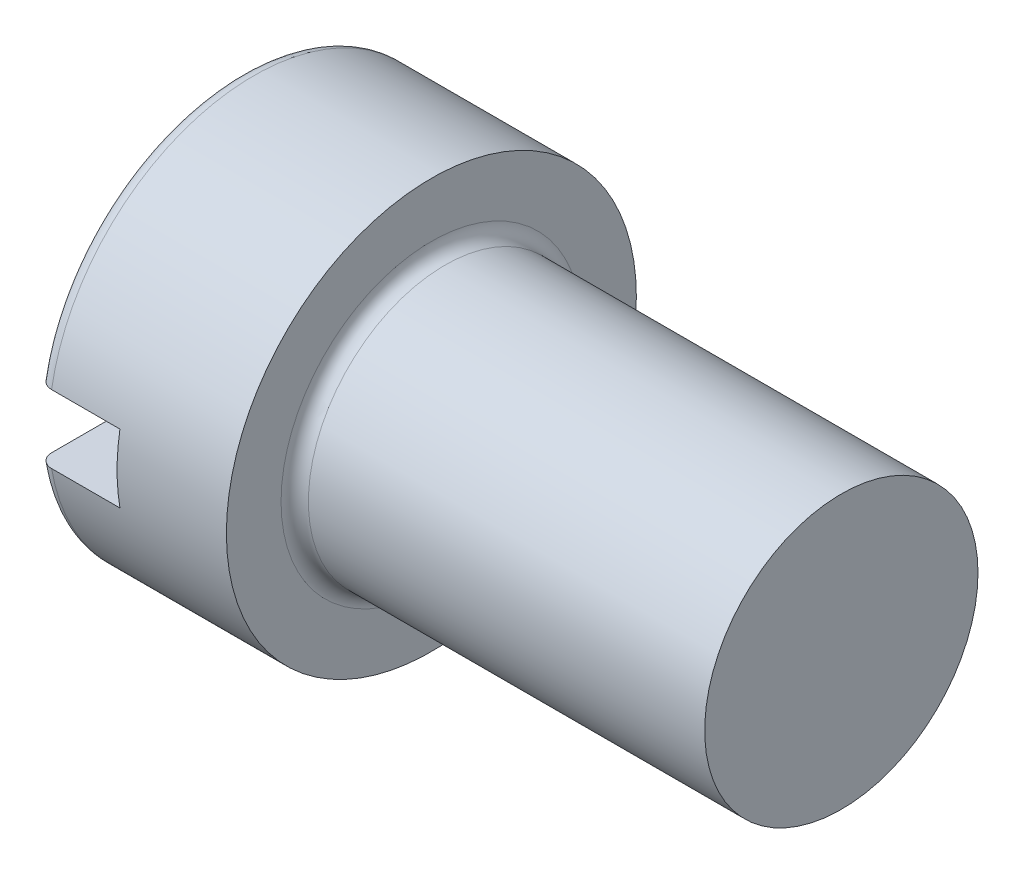
ISO-10303-21;
HEADER;
FILE_DESCRIPTION(('STEP AP214'),'2;1');
FILE_NAME('part.step','',(''),(''),'','','');
FILE_SCHEMA(('AUTOMOTIVE_DESIGN { 1 0 10303 214 1 1 1 1 }'));
ENDSEC;
DATA;
#1=APPLICATION_CONTEXT('core data for automotive mechanical design processes');
#2=APPLICATION_PROTOCOL_DEFINITION('international standard','automotive_design',2000,#1);
#3=PRODUCT_CONTEXT('',#1,'mechanical');
#4=PRODUCT('Part','Part','',(#3));
#5=PRODUCT_RELATED_PRODUCT_CATEGORY('part','',(#4));
#6=PRODUCT_DEFINITION_FORMATION('','',#4);
#7=PRODUCT_DEFINITION_CONTEXT('part definition',#1,'design');
#8=PRODUCT_DEFINITION('design','',#6,#7);
#9=PRODUCT_DEFINITION_SHAPE('','',#8);
#10=(LENGTH_UNIT() NAMED_UNIT(*) SI_UNIT(.MILLI.,.METRE.));
#11=(NAMED_UNIT(*) PLANE_ANGLE_UNIT() SI_UNIT($,.RADIAN.));
#12=(NAMED_UNIT(*) SI_UNIT($,.STERADIAN.) SOLID_ANGLE_UNIT());
#13=UNCERTAINTY_MEASURE_WITH_UNIT(LENGTH_MEASURE(1.E-05),#10,'distance_accuracy_value','');
#14=(GEOMETRIC_REPRESENTATION_CONTEXT(3) GLOBAL_UNCERTAINTY_ASSIGNED_CONTEXT((#13)) GLOBAL_UNIT_ASSIGNED_CONTEXT((#10,
#11,#12)) REPRESENTATION_CONTEXT('',''));
#15=CARTESIAN_POINT('',(0.,0.,0.));
#16=DIRECTION('',(0.,0.,1.));
#17=DIRECTION('',(1.,0.,0.));
#18=AXIS2_PLACEMENT_3D('',#15,#16,#17);
#19=CARTESIAN_POINT('',(1.4,0.,0.));
#20=DIRECTION('',(1.,0.,0.));
#21=DIRECTION('',(0.,0.,-1.));
#22=AXIS2_PLACEMENT_3D('',#19,#20,#21);
#23=PLANE('',#22);
#24=CARTESIAN_POINT('',(1.4,0.,0.));
#25=DIRECTION('',(1.,0.,0.));
#26=DIRECTION('',(0.,0.,-1.));
#27=AXIS2_PLACEMENT_3D('',#24,#25,#26);
#28=CIRCLE('',#27,1.1);
#29=CARTESIAN_POINT('',(1.4,0.,-1.1));
#30=VERTEX_POINT('',#29);
#31=EDGE_CURVE('E115',#30,#30,#28,.F.);
#32=ORIENTED_EDGE('',*,*,#31,.T.);
#33=EDGE_LOOP('',(#32));
#34=FACE_BOUND('',#33,.T.);
#35=CARTESIAN_POINT('',(1.4,0.,0.));
#36=DIRECTION('',(1.,0.,0.));
#37=DIRECTION('',(0.,0.,-1.));
#38=AXIS2_PLACEMENT_3D('',#35,#36,#37);
#39=CIRCLE('',#38,1.5);
#40=CARTESIAN_POINT('',(1.4,0.,-1.5));
#41=VERTEX_POINT('',#40);
#42=EDGE_CURVE('E129',#41,#41,#39,.T.);
#43=ORIENTED_EDGE('',*,*,#42,.T.);
#44=EDGE_LOOP('',(#43));
#45=FACE_BOUND('',#44,.T.);
#46=ADVANCED_FACE('F44',(#34,#45),#23,.T.);
#47=CARTESIAN_POINT('',(4.39999999990914,0.,0.));
#48=DIRECTION('',(-1.,0.,0.));
#49=DIRECTION('',(0.,0.,1.));
#50=AXIS2_PLACEMENT_3D('',#47,#48,#49);
#51=CYLINDRICAL_SURFACE('',#50,1.);
#52=CARTESIAN_POINT('',(1.5,0.,0.));
#53=DIRECTION('',(1.,0.,0.));
#54=DIRECTION('',(0.,0.,-1.));
#55=AXIS2_PLACEMENT_3D('',#52,#53,#54);
#56=CIRCLE('',#55,1.);
#57=CARTESIAN_POINT('',(1.5,0.,-1.));
#58=VERTEX_POINT('',#57);
#59=EDGE_CURVE('E138',#58,#58,#56,.T.);
#60=ORIENTED_EDGE('',*,*,#59,.T.);
#61=EDGE_LOOP('',(#60));
#62=FACE_BOUND('',#61,.T.);
#63=CARTESIAN_POINT('',(4.39999999990914,0.,0.));
#64=DIRECTION('',(1.,0.,0.));
#65=DIRECTION('',(0.,0.,-1.));
#66=AXIS2_PLACEMENT_3D('',#63,#64,#65);
#67=CIRCLE('',#66,1.);
#68=CARTESIAN_POINT('',(4.39999999990914,0.,-1.));
#69=VERTEX_POINT('',#68);
#70=EDGE_CURVE('E123',#69,#69,#67,.T.);
#71=ORIENTED_EDGE('',*,*,#70,.F.);
#72=EDGE_LOOP('',(#71));
#73=FACE_BOUND('',#72,.T.);
#74=ADVANCED_FACE('F174',(#62,#73),#51,.T.);
#75=CARTESIAN_POINT('',(4.39999999990914,0.,0.));
#76=DIRECTION('',(1.,0.,0.));
#77=DIRECTION('',(0.,0.,-1.));
#78=AXIS2_PLACEMENT_3D('',#75,#76,#77);
#79=PLANE('',#78);
#80=ORIENTED_EDGE('',*,*,#70,.T.);
#81=EDGE_LOOP('',(#80));
#82=FACE_BOUND('',#81,.T.);
#83=ADVANCED_FACE('F169',(#82),#79,.T.);
#84=CARTESIAN_POINT('',(1.5,0.,0.));
#85=DIRECTION('',(1.,0.,0.));
#86=DIRECTION('',(0.,0.,-1.));
#87=AXIS2_PLACEMENT_3D('',#84,#85,#86);
#88=TOROIDAL_SURFACE('',#87,1.1,0.1);
#89=ORIENTED_EDGE('',*,*,#31,.F.);
#90=EDGE_LOOP('',(#89));
#91=FACE_BOUND('',#90,.T.);
#92=ORIENTED_EDGE('',*,*,#59,.F.);
#93=EDGE_LOOP('',(#92));
#94=FACE_BOUND('',#93,.T.);
#95=ADVANCED_FACE('F173',(#91,#94),#88,.F.);
#96=CARTESIAN_POINT('',(4.39999999990914,0.,0.));
#97=DIRECTION('',(-1.,0.,0.));
#98=DIRECTION('',(0.,0.,1.));
#99=AXIS2_PLACEMENT_3D('',#96,#97,#98);
#100=CYLINDRICAL_SURFACE('',#99,1.5);
#101=ORIENTED_EDGE('',*,*,#42,.F.);
#102=EDGE_LOOP('',(#101));
#103=FACE_BOUND('',#102,.T.);
#104=DIRECTION('',(-1.,0.,0.));
#105=VECTOR('',#104,1.);
#106=CARTESIAN_POINT('',(4.39999999990914,-0.25,1.4790199457749));
#107=LINE('',#106,#105);
#108=CARTESIAN_POINT('',(0.6,-0.25,1.4790199457749));
#109=VERTEX_POINT('',#108);
#110=CARTESIAN_POINT('',(0.1,-0.25,1.4790199457749));
#111=VERTEX_POINT('',#110);
#112=EDGE_CURVE('E202',#109,#111,#107,.T.);
#113=ORIENTED_EDGE('',*,*,#112,.T.);
#114=CARTESIAN_POINT('',(0.1,0.,0.));
#115=DIRECTION('',(1.,0.,0.));
#116=DIRECTION('',(0.,0.,-1.));
#117=AXIS2_PLACEMENT_3D('',#114,#115,#116);
#118=CIRCLE('',#117,1.5);
#119=CARTESIAN_POINT('',(0.1,-0.25,-1.4790199457749));
#120=VERTEX_POINT('',#119);
#121=EDGE_CURVE('E210',#111,#120,#118,.T.);
#122=ORIENTED_EDGE('',*,*,#121,.T.);
#123=DIRECTION('',(-1.,0.,0.));
#124=VECTOR('',#123,1.);
#125=CARTESIAN_POINT('',(4.39999999990914,-0.25,-1.4790199457749));
#126=LINE('',#125,#124);
#127=CARTESIAN_POINT('',(0.6,-0.25,-1.4790199457749));
#128=VERTEX_POINT('',#127);
#129=EDGE_CURVE('E109',#120,#128,#126,.F.);
#130=ORIENTED_EDGE('',*,*,#129,.T.);
#131=CARTESIAN_POINT('',(0.6,0.,0.));
#132=DIRECTION('',(1.,0.,0.));
#133=DIRECTION('',(0.,0.,-1.));
#134=AXIS2_PLACEMENT_3D('',#131,#132,#133);
#135=CIRCLE('',#134,1.5);
#136=CARTESIAN_POINT('',(0.6,0.250000000000001,-1.4790199457749));
#137=VERTEX_POINT('',#136);
#138=EDGE_CURVE('E103',#128,#137,#135,.T.);
#139=ORIENTED_EDGE('',*,*,#138,.T.);
#140=DIRECTION('',(-1.,0.,0.));
#141=VECTOR('',#140,1.);
#142=CARTESIAN_POINT('',(4.39999999990914,0.250000000000003,-1.4790199457749));
#143=LINE('',#142,#141);
#144=CARTESIAN_POINT('',(0.1,0.250000000000003,-1.4790199457749));
#145=VERTEX_POINT('',#144);
#146=EDGE_CURVE('E107',#137,#145,#143,.T.);
#147=ORIENTED_EDGE('',*,*,#146,.T.);
#148=CARTESIAN_POINT('',(0.1,0.,0.));
#149=DIRECTION('',(1.,0.,0.));
#150=DIRECTION('',(0.,0.,-1.));
#151=AXIS2_PLACEMENT_3D('',#148,#149,#150);
#152=CIRCLE('',#151,1.5);
#153=CARTESIAN_POINT('',(0.1,0.250000000000003,1.4790199457749));
#154=VERTEX_POINT('',#153);
#155=EDGE_CURVE('E208',#145,#154,#152,.T.);
#156=ORIENTED_EDGE('',*,*,#155,.T.);
#157=DIRECTION('',(-1.,0.,0.));
#158=VECTOR('',#157,1.);
#159=CARTESIAN_POINT('',(4.39999999990914,0.250000000000003,1.4790199457749));
#160=LINE('',#159,#158);
#161=CARTESIAN_POINT('',(0.6,0.250000000000001,1.4790199457749));
#162=VERTEX_POINT('',#161);
#163=EDGE_CURVE('E203',#154,#162,#160,.F.);
#164=ORIENTED_EDGE('',*,*,#163,.T.);
#165=EDGE_CURVE('E114',#162,#109,#135,.T.);
#166=ORIENTED_EDGE('',*,*,#165,.T.);
#167=EDGE_LOOP('',(#113,#122,#130,#139,#147,#156,#164,#166));
#168=FACE_BOUND('',#167,.T.);
#169=ADVANCED_FACE('F106',(#103,#168),#100,.T.);
#170=CARTESIAN_POINT('',(0.6,-0.25,-1.9));
#171=DIRECTION('',(1.,0.,0.));
#172=DIRECTION('',(0.,0.,-1.));
#173=AXIS2_PLACEMENT_3D('',#170,#171,#172);
#174=PLANE('',#173);
#175=ORIENTED_EDGE('',*,*,#165,.F.);
#176=DIRECTION('',(0.,0.,1.));
#177=VECTOR('',#176,1.);
#178=CARTESIAN_POINT('',(0.6,0.250000000000001,-1.9));
#179=LINE('',#178,#177);
#180=EDGE_CURVE('E119',#137,#162,#179,.T.);
#181=ORIENTED_EDGE('',*,*,#180,.F.);
#182=ORIENTED_EDGE('',*,*,#138,.F.);
#183=DIRECTION('',(0.,0.,1.));
#184=VECTOR('',#183,1.);
#185=CARTESIAN_POINT('',(0.6,-0.25,-1.9));
#186=LINE('',#185,#184);
#187=EDGE_CURVE('E124',#128,#109,#186,.T.);
#188=ORIENTED_EDGE('',*,*,#187,.T.);
#189=EDGE_LOOP('',(#175,#181,#182,#188));
#190=FACE_BOUND('',#189,.T.);
#191=ADVANCED_FACE('F122',(#190),#174,.F.);
#192=CARTESIAN_POINT('',(0.,0.25,-1.9));
#193=DIRECTION('',(0.,1.,0.));
#194=DIRECTION('',(-1.,0.,0.));
#195=AXIS2_PLACEMENT_3D('',#192,#193,#194);
#196=PLANE('',#195);
#197=DIRECTION('',(0.,0.,1.));
#198=VECTOR('',#197,1.);
#199=CARTESIAN_POINT('',(0.,0.25,0.));
#200=LINE('',#199,#198);
#201=CARTESIAN_POINT('',(0.,0.25,-1.37749773139559));
#202=VERTEX_POINT('',#201);
#203=CARTESIAN_POINT('',(0.,0.25,1.37749773139559));
#204=VERTEX_POINT('',#203);
#205=EDGE_CURVE('E127',#202,#204,#200,.T.);
#206=ORIENTED_EDGE('',*,*,#205,.F.);
#207=CARTESIAN_POINT('',(0.,0.25,-1.37749773139559));
#208=CARTESIAN_POINT('',(-4.51962237202721E-06,0.25,-1.38327561466897));
#209=CARTESIAN_POINT('',(0.000484540476616252,0.25,-1.38905277896921));
#210=CARTESIAN_POINT('',(0.00241850427267125,0.25,-1.40044328379042));
#211=CARTESIAN_POINT('',(0.00386314125782537,0.25,-1.40605666956744));
#212=CARTESIAN_POINT('',(0.00767828061503996,0.25,-1.4169643672149));
#213=CARTESIAN_POINT('',(0.0100494161411575,0.25,-1.42225845802224));
#214=CARTESIAN_POINT('',(0.0156531114589499,0.25,-1.43236735100074));
#215=CARTESIAN_POINT('',(0.0188853880541812,0.25,-1.43718231002635));
#216=CARTESIAN_POINT('',(0.0260941965064199,0.25,-1.44615344469274));
#217=CARTESIAN_POINT('',(0.0300643834070367,0.25,-1.450314716574));
#218=CARTESIAN_POINT('',(0.0386572626677165,0.25,-1.45790065073083));
#219=CARTESIAN_POINT('',(0.0432800648289143,0.25,-1.4613251888073));
#220=CARTESIAN_POINT('',(0.0529745208878046,0.25,-1.46728705568329));
#221=CARTESIAN_POINT('',(0.0580388243448463,0.25,-1.46983635300901));
#222=CARTESIAN_POINT('',(0.0685258595346013,0.25,-1.47403468054353));
#223=CARTESIAN_POINT('',(0.0739483031894057,0.25,-1.47568442467411));
#224=CARTESIAN_POINT('',(0.0828426951818923,0.25,-1.47757739901138));
#225=CARTESIAN_POINT('',(0.0862541329277417,0.25,-1.47811805236472));
#226=CARTESIAN_POINT('',(0.0931098562547379,0.25,-1.47883923059587));
#227=CARTESIAN_POINT('',(0.096554087117261,0.25,-1.47902027582444));
#228=CARTESIAN_POINT('',(0.0999999999999469,0.25,-1.47901994577515));
#229=B_SPLINE_CURVE_WITH_KNOTS('',3,(#207,#208,#209,#210,#211,#212,#213,#214,#215,#216,#217,
#218,#219,#220,#221,#222,#223,#224,#225,#226,#227,#228),.UNSPECIFIED.,.F.,.F.,(4,2,2,2,2,2,2,2,
2,2,4),(0.,0.017312064362878,0.0346192987778577,0.051938381419823,0.069251775491751,
0.086422662872541,0.103596442669422,0.120525035190562,0.137440172868256,0.147784853194134,
0.158114553894397),.UNSPECIFIED.);
#230=EDGE_CURVE('E12',#202,#145,#229,.T.);
#231=ORIENTED_EDGE('',*,*,#230,.T.);
#232=ORIENTED_EDGE('',*,*,#146,.F.);
#233=ORIENTED_EDGE('',*,*,#180,.T.);
#234=ORIENTED_EDGE('',*,*,#163,.F.);
#235=CARTESIAN_POINT('',(0.1,0.250000000000003,1.4790199457749));
#236=CARTESIAN_POINT('',(0.094432263239052,0.250000000000001,1.47902503055942));
#237=CARTESIAN_POINT('',(0.0888663911199395,0.250000000000001,1.47854867251479));
#238=CARTESIAN_POINT('',(0.0778992826475407,0.25,1.47667110901429));
#239=CARTESIAN_POINT('',(0.0724978619494019,0.25,1.4752709822525));
#240=CARTESIAN_POINT('',(0.0620050189140858,0.25,1.47158310986433));
#241=CARTESIAN_POINT('',(0.0569137062368851,0.25,1.46929505233324));
#242=CARTESIAN_POINT('',(0.0471848350270685,0.25,1.46390206881162));
#243=CARTESIAN_POINT('',(0.042547244473237,0.25,1.46079720052424));
#244=CARTESIAN_POINT('',(0.0338258269859854,0.25,1.45384125221807));
#245=CARTESIAN_POINT('',(0.0297454009998116,0.25,1.44998590994135));
#246=CARTESIAN_POINT('',(0.022278693523147,0.25,1.44165224976008));
#247=CARTESIAN_POINT('',(0.0188925590055686,0.25,1.43717380028756));
#248=CARTESIAN_POINT('',(0.0128623061357907,0.25,1.42765778199153));
#249=CARTESIAN_POINT('',(0.0102288271072733,0.25,1.42261347863481));
#250=CARTESIAN_POINT('',(0.00583367268567679,0.25,1.41215921927282));
#251=CARTESIAN_POINT('',(0.00407168755371425,0.25,1.40674939395634));
#252=CARTESIAN_POINT('',(0.00184727838903206,0.25,1.39734615924574));
#253=CARTESIAN_POINT('',(0.00115484995774497,0.25,1.39340549687007));
#254=CARTESIAN_POINT('',(0.000231234727635603,0.25,1.3854762561934));
#255=CARTESIAN_POINT('',(-6.16909699871885E-07,0.25,1.38148775533202));
#256=CARTESIAN_POINT('',(-9.41134700359602E-13,0.25,1.37749773139581));
#257=B_SPLINE_CURVE_WITH_KNOTS('',3,(#235,#236,#237,#238,#239,#240,#241,#242,#243,#244,#245,
#246,#247,#248,#249,#250,#251,#252,#253,#254,#255,#256),.UNSPECIFIED.,.F.,.F.,(4,2,2,2,2,2,2,2,
2,2,4),(0.,0.0166801138099756,0.0333407844733786,0.0500073128595125,0.066672664163841,
0.0834355823268095,0.100202045336881,0.117194955827457,0.134181822496,0.146159480941721,
0.15811983714386),.UNSPECIFIED.);
#258=EDGE_CURVE('E58',#154,#204,#257,.T.);
#259=ORIENTED_EDGE('',*,*,#258,.T.);
#260=EDGE_LOOP('',(#206,#231,#232,#233,#234,#259));
#261=FACE_BOUND('',#260,.T.);
#262=ADVANCED_FACE('F118',(#261),#196,.F.);
#263=CARTESIAN_POINT('',(0.,-0.25,-1.9));
#264=DIRECTION('',(0.,-1.,0.));
#265=DIRECTION('',(0.,0.,-1.));
#266=AXIS2_PLACEMENT_3D('',#263,#264,#265);
#267=PLANE('',#266);
#268=DIRECTION('',(0.,0.,-1.));
#269=VECTOR('',#268,1.);
#270=CARTESIAN_POINT('',(0.,-0.25,0.));
#271=LINE('',#270,#269);
#272=CARTESIAN_POINT('',(0.,-0.25,1.37749773139559));
#273=VERTEX_POINT('',#272);
#274=CARTESIAN_POINT('',(0.,-0.25,-1.37749773139559));
#275=VERTEX_POINT('',#274);
#276=EDGE_CURVE('E135',#273,#275,#271,.T.);
#277=ORIENTED_EDGE('',*,*,#276,.F.);
#278=CARTESIAN_POINT('',(0.,-0.25,1.37749773139559));
#279=CARTESIAN_POINT('',(-4.51962237210414E-06,-0.25,1.38327561466897));
#280=CARTESIAN_POINT('',(0.000484540476616196,-0.25,1.38905277896921));
#281=CARTESIAN_POINT('',(0.00241850427267128,-0.25,1.40044328379042));
#282=CARTESIAN_POINT('',(0.00386314125782546,-0.25,1.40605666956744));
#283=CARTESIAN_POINT('',(0.00767828061504005,-0.25,1.4169643672149));
#284=CARTESIAN_POINT('',(0.0100494161411575,-0.25,1.42225845802224));
#285=CARTESIAN_POINT('',(0.01565311145895,-0.25,1.43236735100074));
#286=CARTESIAN_POINT('',(0.0188853880541813,-0.25,1.43718231002635));
#287=CARTESIAN_POINT('',(0.0260941965064201,-0.25,1.44615344469274));
#288=CARTESIAN_POINT('',(0.0300643834070369,-0.25,1.450314716574));
#289=CARTESIAN_POINT('',(0.0386572626677168,-0.25,1.45790065073083));
#290=CARTESIAN_POINT('',(0.0432800648289147,-0.25,1.4613251888073));
#291=CARTESIAN_POINT('',(0.052974520887805,-0.25,1.46728705568329));
#292=CARTESIAN_POINT('',(0.0580388243448468,-0.25,1.46983635300901));
#293=CARTESIAN_POINT('',(0.0685258595346017,-0.25,1.47403468054353));
#294=CARTESIAN_POINT('',(0.0739483031894062,-0.25,1.47568442467411));
#295=CARTESIAN_POINT('',(0.0828426951818927,-0.25,1.47757739901138));
#296=CARTESIAN_POINT('',(0.0862541329277421,-0.25,1.47811805236472));
#297=CARTESIAN_POINT('',(0.0931098562547381,-0.25,1.47883923059587));
#298=CARTESIAN_POINT('',(0.0965540871172611,-0.25,1.47902027582444));
#299=CARTESIAN_POINT('',(0.0999999999999469,-0.25,1.47901994577515));
#300=B_SPLINE_CURVE_WITH_KNOTS('',3,(#278,#279,#280,#281,#282,#283,#284,#285,#286,#287,#288,
#289,#290,#291,#292,#293,#294,#295,#296,#297,#298,#299),.UNSPECIFIED.,.F.,.F.,(4,2,2,2,2,2,2,2,
2,2,4),(0.,0.0173120643628782,0.0346192987778579,0.0519383814198232,0.0692517754917513,
0.0864226628725416,0.103596442669423,0.120525035190563,0.137440172868256,0.147784853194134,
0.158114553894397),.UNSPECIFIED.);
#301=EDGE_CURVE('E153',#273,#111,#300,.T.);
#302=ORIENTED_EDGE('',*,*,#301,.T.);
#303=ORIENTED_EDGE('',*,*,#112,.F.);
#304=ORIENTED_EDGE('',*,*,#187,.F.);
#305=ORIENTED_EDGE('',*,*,#129,.F.);
#306=CARTESIAN_POINT('',(0.1,-0.25,-1.4790199457749));
#307=CARTESIAN_POINT('',(0.0944322632390521,-0.25,-1.47902503055942));
#308=CARTESIAN_POINT('',(0.0888663911199396,-0.25,-1.47854867251479));
#309=CARTESIAN_POINT('',(0.0778992826475408,-0.25,-1.47667110901429));
#310=CARTESIAN_POINT('',(0.072497861949402,-0.25,-1.4752709822525));
#311=CARTESIAN_POINT('',(0.0620050189140858,-0.25,-1.47158310986433));
#312=CARTESIAN_POINT('',(0.0569137062368851,-0.25,-1.46929505233324));
#313=CARTESIAN_POINT('',(0.0471848350270685,-0.25,-1.46390206881162));
#314=CARTESIAN_POINT('',(0.0425472444732371,-0.25,-1.46079720052424));
#315=CARTESIAN_POINT('',(0.0338258269859856,-0.25,-1.45384125221807));
#316=CARTESIAN_POINT('',(0.0297454009998118,-0.25,-1.44998590994135));
#317=CARTESIAN_POINT('',(0.0222786935231473,-0.25,-1.44165224976008));
#318=CARTESIAN_POINT('',(0.0188925590055688,-0.25,-1.43717380028756));
#319=CARTESIAN_POINT('',(0.0128623061357908,-0.25,-1.42765778199154));
#320=CARTESIAN_POINT('',(0.0102288271072733,-0.25,-1.42261347863481));
#321=CARTESIAN_POINT('',(0.00583367268567676,-0.25,-1.41215921927282));
#322=CARTESIAN_POINT('',(0.00407168755371425,-0.25,-1.40674939395634));
#323=CARTESIAN_POINT('',(0.00184727838903207,-0.25,-1.39734615924574));
#324=CARTESIAN_POINT('',(0.00115484995774496,-0.25,-1.39340549687007));
#325=CARTESIAN_POINT('',(0.000231234727635586,-0.25,-1.3854762561934));
#326=CARTESIAN_POINT('',(-6.16909699891273E-07,-0.25,-1.38148775533202));
#327=CARTESIAN_POINT('',(-9.41127924096024E-13,-0.25,-1.37749773139581));
#328=B_SPLINE_CURVE_WITH_KNOTS('',3,(#306,#307,#308,#309,#310,#311,#312,#313,#314,#315,#316,
#317,#318,#319,#320,#321,#322,#323,#324,#325,#326,#327),.UNSPECIFIED.,.F.,.F.,(4,2,2,2,2,2,2,2,
2,2,4),(0.,0.0166801138099755,0.0333407844733785,0.0500073128595125,0.0666726641638407,
0.0834355823268091,0.100202045336881,0.117194955827457,0.134181822496,0.146159480941721,
0.15811983714386),.UNSPECIFIED.);
#329=EDGE_CURVE('E146',#120,#275,#328,.T.);
#330=ORIENTED_EDGE('',*,*,#329,.T.);
#331=EDGE_LOOP('',(#277,#302,#303,#304,#305,#330));
#332=FACE_BOUND('',#331,.T.);
#333=ADVANCED_FACE('F162',(#332),#267,.F.);
#334=CARTESIAN_POINT('',(0.,0.,0.));
#335=DIRECTION('',(1.,0.,0.));
#336=DIRECTION('',(0.,0.,-1.));
#337=AXIS2_PLACEMENT_3D('',#334,#335,#336);
#338=PLANE('',#337);
#339=ORIENTED_EDGE('',*,*,#205,.T.);
#340=CARTESIAN_POINT('',(0.,0.,0.));
#341=DIRECTION('',(1.,0.,0.));
#342=DIRECTION('',(0.,0.,-1.));
#343=AXIS2_PLACEMENT_3D('',#340,#341,#342);
#344=CIRCLE('',#343,1.4);
#345=EDGE_CURVE('E209',#204,#202,#344,.F.);
#346=ORIENTED_EDGE('',*,*,#345,.T.);
#347=EDGE_LOOP('',(#339,#346));
#348=FACE_BOUND('',#347,.T.);
#349=ADVANCED_FACE('F167',(#348),#338,.F.);
#350=ORIENTED_EDGE('',*,*,#276,.T.);
#351=CARTESIAN_POINT('',(0.,0.,0.));
#352=DIRECTION('',(1.,0.,0.));
#353=DIRECTION('',(0.,0.,-1.));
#354=AXIS2_PLACEMENT_3D('',#351,#352,#353);
#355=CIRCLE('',#354,1.4);
#356=EDGE_CURVE('E143',#275,#273,#355,.F.);
#357=ORIENTED_EDGE('',*,*,#356,.T.);
#358=EDGE_LOOP('',(#350,#357));
#359=FACE_BOUND('',#358,.T.);
#360=ADVANCED_FACE('F179',(#359),#338,.F.);
#361=CARTESIAN_POINT('',(0.1,0.,0.));
#362=DIRECTION('',(1.,0.,0.));
#363=DIRECTION('',(0.,0.,-1.));
#364=AXIS2_PLACEMENT_3D('',#361,#362,#363);
#365=TOROIDAL_SURFACE('',#364,1.4,0.1);
#366=ORIENTED_EDGE('',*,*,#329,.F.);
#367=ORIENTED_EDGE('',*,*,#121,.F.);
#368=ORIENTED_EDGE('',*,*,#301,.F.);
#369=ORIENTED_EDGE('',*,*,#356,.F.);
#370=EDGE_LOOP('',(#366,#367,#368,#369));
#371=FACE_BOUND('',#370,.T.);
#372=ADVANCED_FACE('F159',(#371),#365,.T.);
#373=CARTESIAN_POINT('',(0.1,0.,0.));
#374=DIRECTION('',(1.,0.,0.));
#375=DIRECTION('',(0.,0.,-1.));
#376=AXIS2_PLACEMENT_3D('',#373,#374,#375);
#377=TOROIDAL_SURFACE('',#376,1.4,0.1);
#378=ORIENTED_EDGE('',*,*,#258,.F.);
#379=ORIENTED_EDGE('',*,*,#155,.F.);
#380=ORIENTED_EDGE('',*,*,#230,.F.);
#381=ORIENTED_EDGE('',*,*,#345,.F.);
#382=EDGE_LOOP('',(#378,#379,#380,#381));
#383=FACE_BOUND('',#382,.T.);
#384=ADVANCED_FACE('F46',(#383),#377,.T.);
#385=CLOSED_SHELL('',(#46,#74,#83,#95,#169,#191,#262,#333,#349,#360,#372,#384));
#386=MANIFOLD_SOLID_BREP('B2',#385);
#387=ADVANCED_BREP_SHAPE_REPRESENTATION('',(#18,#386),#14);
#388=SHAPE_DEFINITION_REPRESENTATION(#9,#387);
ENDSEC;
END-ISO-10303-21;
